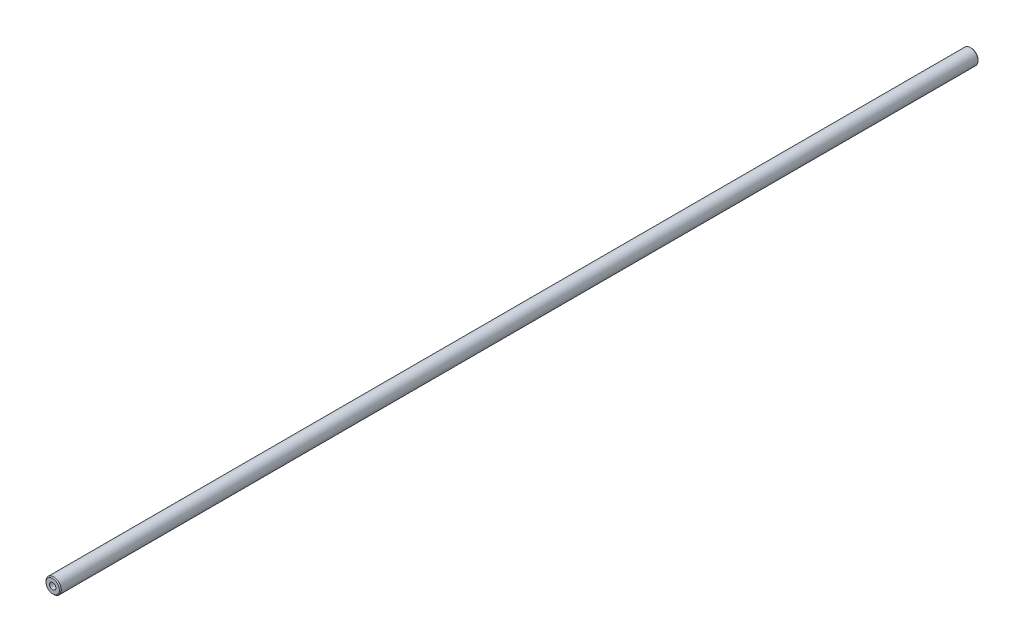
ISO-10303-21;
HEADER;
FILE_DESCRIPTION(('STEP AP214'),'2;1');
FILE_NAME('part.step','',(''),(''),'','','');
FILE_SCHEMA(('AUTOMOTIVE_DESIGN { 1 0 10303 214 1 1 1 1 }'));
ENDSEC;
DATA;
#1=APPLICATION_CONTEXT('core data for automotive mechanical design processes');
#2=APPLICATION_PROTOCOL_DEFINITION('international standard','automotive_design',2000,#1);
#3=PRODUCT_CONTEXT('',#1,'mechanical');
#4=PRODUCT('Part','Part','',(#3));
#5=PRODUCT_RELATED_PRODUCT_CATEGORY('part','',(#4));
#6=PRODUCT_DEFINITION_FORMATION('','',#4);
#7=PRODUCT_DEFINITION_CONTEXT('part definition',#1,'design');
#8=PRODUCT_DEFINITION('design','',#6,#7);
#9=PRODUCT_DEFINITION_SHAPE('','',#8);
#10=(LENGTH_UNIT() NAMED_UNIT(*) SI_UNIT(.MILLI.,.METRE.));
#11=(NAMED_UNIT(*) PLANE_ANGLE_UNIT() SI_UNIT($,.RADIAN.));
#12=(NAMED_UNIT(*) SI_UNIT($,.STERADIAN.) SOLID_ANGLE_UNIT());
#13=UNCERTAINTY_MEASURE_WITH_UNIT(LENGTH_MEASURE(1.E-05),#10,'distance_accuracy_value','');
#14=(GEOMETRIC_REPRESENTATION_CONTEXT(3) GLOBAL_UNCERTAINTY_ASSIGNED_CONTEXT((#13)) GLOBAL_UNIT_ASSIGNED_CONTEXT((#10,
#11,#12)) REPRESENTATION_CONTEXT('',''));
#15=CARTESIAN_POINT('',(0.,0.,0.));
#16=DIRECTION('',(0.,0.,1.));
#17=DIRECTION('',(1.,0.,0.));
#18=AXIS2_PLACEMENT_3D('',#15,#16,#17);
#19=CARTESIAN_POINT('',(0.,0.,480.));
#20=DIRECTION('',(0.,0.,-1.));
#21=DIRECTION('',(-1.,0.,0.));
#22=AXIS2_PLACEMENT_3D('',#19,#20,#21);
#23=CYLINDRICAL_SURFACE('',#22,4.);
#24=CARTESIAN_POINT('',(0.,0.,479.5));
#25=DIRECTION('',(0.,0.,1.));
#26=DIRECTION('',(1.,0.,0.));
#27=AXIS2_PLACEMENT_3D('',#24,#25,#26);
#28=CIRCLE('',#27,4.);
#29=CARTESIAN_POINT('',(4.,0.,479.5));
#30=VERTEX_POINT('',#29);
#31=EDGE_CURVE('E46',#30,#30,#28,.F.);
#32=ORIENTED_EDGE('',*,*,#31,.T.);
#33=EDGE_LOOP('',(#32));
#34=FACE_BOUND('',#33,.T.);
#35=CARTESIAN_POINT('',(0.,0.,0.500000000000056));
#36=DIRECTION('',(0.,0.,1.));
#37=DIRECTION('',(1.,0.,0.));
#38=AXIS2_PLACEMENT_3D('',#35,#36,#37);
#39=CIRCLE('',#38,4.);
#40=CARTESIAN_POINT('',(4.,0.,0.500000000000056));
#41=VERTEX_POINT('',#40);
#42=EDGE_CURVE('E76',#41,#41,#39,.T.);
#43=ORIENTED_EDGE('',*,*,#42,.T.);
#44=EDGE_LOOP('',(#43));
#45=FACE_BOUND('',#44,.T.);
#46=ADVANCED_FACE('F38',(#34,#45),#23,.T.);
#47=CARTESIAN_POINT('',(0.,0.,480.));
#48=DIRECTION('',(0.,0.,1.));
#49=DIRECTION('',(1.,0.,0.));
#50=AXIS2_PLACEMENT_3D('',#47,#48,#49);
#51=PLANE('',#50);
#52=CARTESIAN_POINT('',(0.,0.,480.));
#53=DIRECTION('',(0.,0.,1.));
#54=DIRECTION('',(1.,0.,0.));
#55=AXIS2_PLACEMENT_3D('',#52,#53,#54);
#56=CIRCLE('',#55,1.64999999999999);
#57=CARTESIAN_POINT('',(1.64999999999999,0.,480.));
#58=VERTEX_POINT('',#57);
#59=EDGE_CURVE('E62',#58,#58,#56,.T.);
#60=ORIENTED_EDGE('',*,*,#59,.F.);
#61=EDGE_LOOP('',(#60));
#62=FACE_BOUND('',#61,.T.);
#63=CARTESIAN_POINT('',(0.,0.,480.));
#64=DIRECTION('',(0.,0.,1.));
#65=DIRECTION('',(1.,0.,0.));
#66=AXIS2_PLACEMENT_3D('',#63,#64,#65);
#67=CIRCLE('',#66,3.5);
#68=CARTESIAN_POINT('',(3.5,0.,480.));
#69=VERTEX_POINT('',#68);
#70=EDGE_CURVE('E73',#69,#69,#67,.T.);
#71=ORIENTED_EDGE('',*,*,#70,.T.);
#72=EDGE_LOOP('',(#71));
#73=FACE_BOUND('',#72,.T.);
#74=ADVANCED_FACE('F89',(#62,#73),#51,.T.);
#75=CARTESIAN_POINT('',(0.,0.,0.));
#76=DIRECTION('',(0.,0.,1.));
#77=DIRECTION('',(1.,0.,0.));
#78=AXIS2_PLACEMENT_3D('',#75,#76,#77);
#79=PLANE('',#78);
#80=CARTESIAN_POINT('',(0.,0.,0.));
#81=DIRECTION('',(0.,0.,-1.));
#82=DIRECTION('',(-1.,0.,0.));
#83=AXIS2_PLACEMENT_3D('',#80,#81,#82);
#84=CIRCLE('',#83,1.64999999999999);
#85=CARTESIAN_POINT('',(-1.64999999999999,0.,0.));
#86=VERTEX_POINT('',#85);
#87=EDGE_CURVE('E63',#86,#86,#84,.T.);
#88=ORIENTED_EDGE('',*,*,#87,.F.);
#89=EDGE_LOOP('',(#88));
#90=FACE_BOUND('',#89,.T.);
#91=CARTESIAN_POINT('',(0.,0.,0.));
#92=DIRECTION('',(0.,0.,1.));
#93=DIRECTION('',(1.,0.,0.));
#94=AXIS2_PLACEMENT_3D('',#91,#92,#93);
#95=CIRCLE('',#94,3.49999999999995);
#96=CARTESIAN_POINT('',(3.49999999999995,0.,0.));
#97=VERTEX_POINT('',#96);
#98=EDGE_CURVE('E11',#97,#97,#95,.F.);
#99=ORIENTED_EDGE('',*,*,#98,.T.);
#100=EDGE_LOOP('',(#99));
#101=FACE_BOUND('',#100,.T.);
#102=ADVANCED_FACE('F86',(#90,#101),#79,.F.);
#103=CARTESIAN_POINT('',(0.,0.,480.));
#104=DIRECTION('',(0.,0.,-1.));
#105=DIRECTION('',(-1.,0.,0.));
#106=AXIS2_PLACEMENT_3D('',#103,#104,#105);
#107=CONICAL_SURFACE('',#106,3.5,0.7853981633975);
#108=ORIENTED_EDGE('',*,*,#31,.F.);
#109=EDGE_LOOP('',(#108));
#110=FACE_BOUND('',#109,.T.);
#111=ORIENTED_EDGE('',*,*,#70,.F.);
#112=EDGE_LOOP('',(#111));
#113=FACE_BOUND('',#112,.T.);
#114=ADVANCED_FACE('F83',(#110,#113),#107,.T.);
#115=CARTESIAN_POINT('',(0.,0.,0.500000000000056));
#116=DIRECTION('',(0.,0.,1.));
#117=DIRECTION('',(1.,0.,0.));
#118=AXIS2_PLACEMENT_3D('',#115,#116,#117);
#119=CONICAL_SURFACE('',#118,4.,0.785398163397445);
#120=ORIENTED_EDGE('',*,*,#98,.F.);
#121=EDGE_LOOP('',(#120));
#122=FACE_BOUND('',#121,.T.);
#123=ORIENTED_EDGE('',*,*,#42,.F.);
#124=EDGE_LOOP('',(#123));
#125=FACE_BOUND('',#124,.T.);
#126=ADVANCED_FACE('F40',(#122,#125),#119,.T.);
#127=CARTESIAN_POINT('',(0.,0.,468.5));
#128=DIRECTION('',(0.,0.,1.));
#129=DIRECTION('',(1.,0.,0.));
#130=AXIS2_PLACEMENT_3D('',#127,#128,#129);
#131=CONICAL_SURFACE('',#130,1.64999999999999,1.02974425867666);
#132=CARTESIAN_POINT('',(0.,0.,467.508579978605));
#133=VERTEX_POINT('',#132);
#134=VERTEX_LOOP('',#133);
#135=FACE_BOUND('',#134,.T.);
#136=CARTESIAN_POINT('',(0.,0.,468.5));
#137=DIRECTION('',(0.,0.,1.));
#138=DIRECTION('',(1.,0.,0.));
#139=AXIS2_PLACEMENT_3D('',#136,#137,#138);
#140=CIRCLE('',#139,1.64999999999999);
#141=CARTESIAN_POINT('',(1.64999999999999,0.,468.5));
#142=VERTEX_POINT('',#141);
#143=EDGE_CURVE('E66',#142,#142,#140,.T.);
#144=ORIENTED_EDGE('',*,*,#143,.T.);
#145=EDGE_LOOP('',(#144));
#146=FACE_BOUND('',#145,.T.);
#147=ADVANCED_FACE('F102',(#135,#146),#131,.F.);
#148=CARTESIAN_POINT('',(0.,0.,480.));
#149=DIRECTION('',(0.,0.,1.));
#150=DIRECTION('',(1.,0.,0.));
#151=AXIS2_PLACEMENT_3D('',#148,#149,#150);
#152=CYLINDRICAL_SURFACE('',#151,1.64999999999999);
#153=ORIENTED_EDGE('',*,*,#143,.F.);
#154=EDGE_LOOP('',(#153));
#155=FACE_BOUND('',#154,.T.);
#156=ORIENTED_EDGE('',*,*,#59,.T.);
#157=EDGE_LOOP('',(#156));
#158=FACE_BOUND('',#157,.T.);
#159=ADVANCED_FACE('F56',(#155,#158),#152,.F.);
#160=CARTESIAN_POINT('',(0.,0.,11.5));
#161=DIRECTION('',(0.,0.,-1.));
#162=DIRECTION('',(-1.,0.,0.));
#163=AXIS2_PLACEMENT_3D('',#160,#161,#162);
#164=CONICAL_SURFACE('',#163,1.64999999999999,1.02974425867665);
#165=CARTESIAN_POINT('',(0.,0.,12.4914200213955));
#166=VERTEX_POINT('',#165);
#167=VERTEX_LOOP('',#166);
#168=FACE_BOUND('',#167,.T.);
#169=CARTESIAN_POINT('',(0.,0.,11.5));
#170=DIRECTION('',(0.,0.,-1.));
#171=DIRECTION('',(-1.,0.,0.));
#172=AXIS2_PLACEMENT_3D('',#169,#170,#171);
#173=CIRCLE('',#172,1.64999999999999);
#174=CARTESIAN_POINT('',(-1.64999999999999,0.,11.5));
#175=VERTEX_POINT('',#174);
#176=EDGE_CURVE('E60',#175,#175,#173,.T.);
#177=ORIENTED_EDGE('',*,*,#176,.T.);
#178=EDGE_LOOP('',(#177));
#179=FACE_BOUND('',#178,.T.);
#180=ADVANCED_FACE('F52',(#168,#179),#164,.F.);
#181=CARTESIAN_POINT('',(0.,0.,0.));
#182=DIRECTION('',(0.,0.,-1.));
#183=DIRECTION('',(-1.,0.,0.));
#184=AXIS2_PLACEMENT_3D('',#181,#182,#183);
#185=CYLINDRICAL_SURFACE('',#184,1.64999999999999);
#186=ORIENTED_EDGE('',*,*,#176,.F.);
#187=EDGE_LOOP('',(#186));
#188=FACE_BOUND('',#187,.T.);
#189=ORIENTED_EDGE('',*,*,#87,.T.);
#190=EDGE_LOOP('',(#189));
#191=FACE_BOUND('',#190,.T.);
#192=ADVANCED_FACE('F55',(#188,#191),#185,.F.);
#193=CLOSED_SHELL('',(#46,#74,#102,#114,#126,#147,#159,#180,#192));
#194=MANIFOLD_SOLID_BREP('B2',#193);
#195=ADVANCED_BREP_SHAPE_REPRESENTATION('',(#18,#194),#14);
#196=SHAPE_DEFINITION_REPRESENTATION(#9,#195);
ENDSEC;
END-ISO-10303-21;
